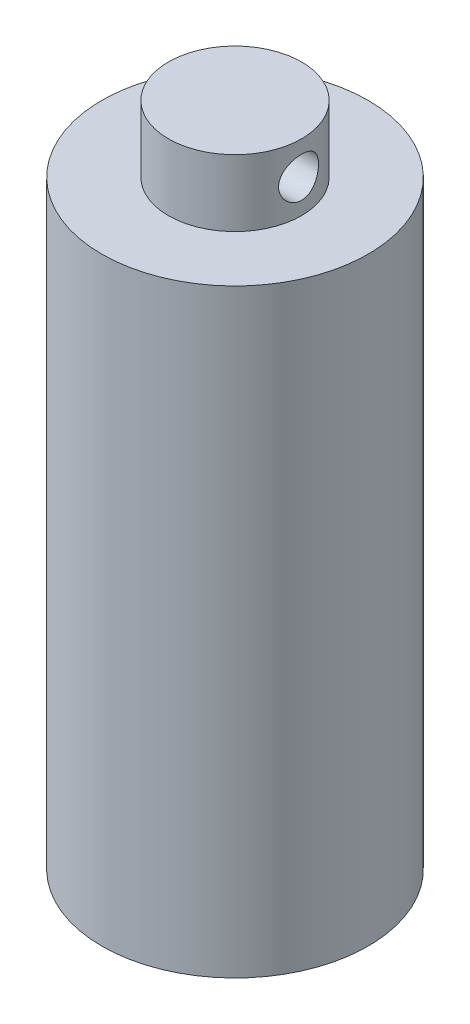
ISO-10303-21;
HEADER;
FILE_DESCRIPTION(('STEP AP214'),'2;1');
FILE_NAME('part.step','',(''),(''),'','','');
FILE_SCHEMA(('AUTOMOTIVE_DESIGN { 1 0 10303 214 1 1 1 1 }'));
ENDSEC;
DATA;
#1=APPLICATION_CONTEXT('core data for automotive mechanical design processes');
#2=APPLICATION_PROTOCOL_DEFINITION('international standard','automotive_design',2000,#1);
#3=PRODUCT_CONTEXT('',#1,'mechanical');
#4=PRODUCT('Part','Part','',(#3));
#5=PRODUCT_RELATED_PRODUCT_CATEGORY('part','',(#4));
#6=PRODUCT_DEFINITION_FORMATION('','',#4);
#7=PRODUCT_DEFINITION_CONTEXT('part definition',#1,'design');
#8=PRODUCT_DEFINITION('design','',#6,#7);
#9=PRODUCT_DEFINITION_SHAPE('','',#8);
#10=(LENGTH_UNIT() NAMED_UNIT(*) SI_UNIT(.MILLI.,.METRE.));
#11=(NAMED_UNIT(*) PLANE_ANGLE_UNIT() SI_UNIT($,.RADIAN.));
#12=(NAMED_UNIT(*) SI_UNIT($,.STERADIAN.) SOLID_ANGLE_UNIT());
#13=UNCERTAINTY_MEASURE_WITH_UNIT(LENGTH_MEASURE(1.E-05),#10,'distance_accuracy_value','');
#14=(GEOMETRIC_REPRESENTATION_CONTEXT(3) GLOBAL_UNCERTAINTY_ASSIGNED_CONTEXT((#13)) GLOBAL_UNIT_ASSIGNED_CONTEXT((#10,
#11,#12)) REPRESENTATION_CONTEXT('',''));
#15=CARTESIAN_POINT('',(0.,0.,0.));
#16=DIRECTION('',(0.,0.,1.));
#17=DIRECTION('',(1.,0.,0.));
#18=AXIS2_PLACEMENT_3D('',#15,#16,#17);
#19=CARTESIAN_POINT('',(7.40987557722377E-10,14.2166164454677,-3.61810756681271E-08));
#20=DIRECTION('',(0.,-1.,0.));
#21=DIRECTION('',(0.,0.,-1.));
#22=AXIS2_PLACEMENT_3D('',#19,#20,#21);
#23=CYLINDRICAL_SURFACE('',#22,3.81);
#24=CARTESIAN_POINT('',(7.40987557722377E-10,14.2166164454677,-3.61810756681271E-08));
#25=DIRECTION('',(0.,1.,0.));
#26=DIRECTION('',(0.,0.,1.));
#27=AXIS2_PLACEMENT_3D('',#24,#25,#26);
#28=CIRCLE('',#27,3.81);
#29=CARTESIAN_POINT('',(7.40987557722377E-10,14.2166164454677,3.80999996381892));
#30=VERTEX_POINT('',#29);
#31=EDGE_CURVE('E10',#30,#30,#28,.T.);
#32=ORIENTED_EDGE('',*,*,#31,.F.);
#33=EDGE_LOOP('',(#32));
#34=FACE_BOUND('',#33,.T.);
#35=CARTESIAN_POINT('',(7.40987557722377E-10,-2.92838355453233,-3.61810756681271E-08));
#36=DIRECTION('',(0.,1.,0.));
#37=DIRECTION('',(0.,0.,1.));
#38=AXIS2_PLACEMENT_3D('',#35,#36,#37);
#39=CIRCLE('',#38,3.81);
#40=CARTESIAN_POINT('',(7.40987557722377E-10,-2.92838355453233,3.80999996381892));
#41=VERTEX_POINT('',#40);
#42=EDGE_CURVE('E49',#41,#41,#39,.T.);
#43=ORIENTED_EDGE('',*,*,#42,.T.);
#44=EDGE_LOOP('',(#43));
#45=FACE_BOUND('',#44,.T.);
#46=ADVANCED_FACE('F37',(#34,#45),#23,.T.);
#47=CARTESIAN_POINT('',(7.40987557722377E-10,14.2166164454677,-3.61810756681271E-08));
#48=DIRECTION('',(0.,1.,0.));
#49=DIRECTION('',(0.,0.,1.));
#50=AXIS2_PLACEMENT_3D('',#47,#48,#49);
#51=PLANE('',#50);
#52=CARTESIAN_POINT('',(7.40987557722377E-10,14.2166164454677,-3.61810756681271E-08));
#53=DIRECTION('',(0.,1.,0.));
#54=DIRECTION('',(0.,0.,1.));
#55=AXIS2_PLACEMENT_3D('',#52,#53,#54);
#56=CIRCLE('',#55,1.905);
#57=CARTESIAN_POINT('',(7.40987557722377E-10,14.2166164454677,1.90499996381892));
#58=VERTEX_POINT('',#57);
#59=EDGE_CURVE('E57',#58,#58,#56,.T.);
#60=ORIENTED_EDGE('',*,*,#59,.F.);
#61=EDGE_LOOP('',(#60));
#62=FACE_BOUND('',#61,.T.);
#63=ORIENTED_EDGE('',*,*,#31,.T.);
#64=EDGE_LOOP('',(#63));
#65=FACE_BOUND('',#64,.T.);
#66=ADVANCED_FACE('F83',(#62,#65),#51,.T.);
#67=CARTESIAN_POINT('',(7.40987557722377E-10,-2.92838355453233,-3.61810756681271E-08));
#68=DIRECTION('',(0.,1.,0.));
#69=DIRECTION('',(0.,0.,1.));
#70=AXIS2_PLACEMENT_3D('',#67,#68,#69);
#71=PLANE('',#70);
#72=ORIENTED_EDGE('',*,*,#42,.F.);
#73=EDGE_LOOP('',(#72));
#74=FACE_BOUND('',#73,.T.);
#75=ADVANCED_FACE('F79',(#74),#71,.F.);
#76=CARTESIAN_POINT('',(7.40987557722377E-10,16.1216164454677,-3.61810756681271E-08));
#77=DIRECTION('',(0.,-1.,0.));
#78=DIRECTION('',(0.,0.,-1.));
#79=AXIS2_PLACEMENT_3D('',#76,#77,#78);
#80=CYLINDRICAL_SURFACE('',#79,1.905);
#81=CARTESIAN_POINT('',(-1.81725417795829,15.1691164454677,-0.571500036181076));
#82=CARTESIAN_POINT('',(-1.81725450202238,15.2004325682242,-0.57149964616737));
#83=CARTESIAN_POINT('',(-1.8180725265083,15.2317525498383,-0.568917268305004));
#84=CARTESIAN_POINT('',(-1.82124316314864,15.2934768455361,-0.558682603530016));
#85=CARTESIAN_POINT('',(-1.82359628804812,15.3238808501195,-0.551028622617429));
#86=CARTESIAN_POINT('',(-1.82954714958093,15.3828706769484,-0.530934026137226));
#87=CARTESIAN_POINT('',(-1.83314281515854,15.4114594315603,-0.518501371772505));
#88=CARTESIAN_POINT('',(-1.84117081230504,15.4661524023174,-0.489228503689025));
#89=CARTESIAN_POINT('',(-1.8456032690961,15.4922562457258,-0.47238763015342));
#90=CARTESIAN_POINT('',(-1.85496274417567,15.5420645402783,-0.434205749460496));
#91=CARTESIAN_POINT('',(-1.85990029892336,15.5656787325854,-0.412749555520851));
#92=CARTESIAN_POINT('',(-1.86962362324104,15.6090335049214,-0.36619294269895));
#93=CARTESIAN_POINT('',(-1.87440937323407,15.628773587029,-0.341092056101771));
#94=CARTESIAN_POINT('',(-1.88340954680566,15.6642117341042,-0.287316493980457));
#95=CARTESIAN_POINT('',(-1.88761010900335,15.6798177701804,-0.258578648310016));
#96=CARTESIAN_POINT('',(-1.89484420011704,15.7059405911629,-0.198739026066801));
#97=CARTESIAN_POINT('',(-1.89787798069705,15.7164584736634,-0.167637760996869));
#98=CARTESIAN_POINT('',(-1.90236213053263,15.7318077258832,-0.10489842403342));
#99=CARTESIAN_POINT('',(-1.90385531283618,15.7367931591033,-0.0733011591824725));
#100=CARTESIAN_POINT('',(-1.90524079697916,15.741423146158,-0.00968575102956392));
#101=CARTESIAN_POINT('',(-1.90513343506432,15.7410688217798,0.0223323024601156));
#102=CARTESIAN_POINT('',(-1.90336018980429,15.7351327625528,0.0847995744835859));
#103=CARTESIAN_POINT('',(-1.90174405024107,15.7297178666261,0.115266281790275));
#104=CARTESIAN_POINT('',(-1.89719529850798,15.7140869064538,0.174836754140527));
#105=CARTESIAN_POINT('',(-1.8942626029687,15.7038705381585,0.203940432742929));
#106=CARTESIAN_POINT('',(-1.88734149121939,15.6788136645452,0.260355295158763));
#107=CARTESIAN_POINT('',(-1.88334117672744,15.6639206871981,0.28764165346752));
#108=CARTESIAN_POINT('',(-1.87470913012798,15.6299748636925,0.339381304530306));
#109=CARTESIAN_POINT('',(-1.87007724831828,15.6109210306286,0.363833923045205));
#110=CARTESIAN_POINT('',(-1.86046700661962,15.5683291024313,0.410207607281779));
#111=CARTESIAN_POINT('',(-1.85548217343642,15.5446464593173,0.431994748951753));
#112=CARTESIAN_POINT('',(-1.84588396262774,15.4939151286516,0.471326116185649));
#113=CARTESIAN_POINT('',(-1.841270621947,15.4668661069945,0.48886992009858));
#114=CARTESIAN_POINT('',(-1.83290681045212,15.4098172076837,0.519356286047003));
#115=CARTESIAN_POINT('',(-1.82916503804793,15.3797915209935,0.532253112814533));
#116=CARTESIAN_POINT('',(-1.82307125483124,15.3178560990503,0.55276757638563));
#117=CARTESIAN_POINT('',(-1.82071879067906,15.2859469821143,0.560386935399275));
#118=CARTESIAN_POINT('',(-1.81776947614541,15.2224250660289,0.569879838593526));
#119=CARTESIAN_POINT('',(-1.8171104574853,15.1908455521678,0.571956959527624));
#120=CARTESIAN_POINT('',(-1.81745074295234,15.1277882705654,0.570874922776948));
#121=CARTESIAN_POINT('',(-1.81844981494537,15.0963104891997,0.567716498073168));
#122=CARTESIAN_POINT('',(-1.82193269722707,15.0351993734582,0.556434323036357));
#123=CARTESIAN_POINT('',(-1.82437726171871,15.0055393668826,0.54844169687204));
#124=CARTESIAN_POINT('',(-1.83043502738383,14.9479834012679,0.527870045038638));
#125=CARTESIAN_POINT('',(-1.83404840898626,14.9200877153803,0.515290311224855));
#126=CARTESIAN_POINT('',(-1.8421572306874,14.866024291656,0.485515393077572));
#127=CARTESIAN_POINT('',(-1.84667374203242,14.839923026772,0.468205393317015));
#128=CARTESIAN_POINT('',(-1.85603466277656,14.7909213270128,0.429597662916393));
#129=CARTESIAN_POINT('',(-1.86087915048101,14.7680216605572,0.408298977806881));
#130=CARTESIAN_POINT('',(-1.87057144307678,14.7251827108522,0.361361369298985));
#131=CARTESIAN_POINT('',(-1.87541247294887,14.7053877708236,0.335588979910607));
#132=CARTESIAN_POINT('',(-1.88436828442156,14.6704001323761,0.28097290374781));
#133=CARTESIAN_POINT('',(-1.88848310208484,14.6552072054009,0.252129369596167));
#134=CARTESIAN_POINT('',(-1.89549774676855,14.6300014338211,0.192380391111613));
#135=CARTESIAN_POINT('',(-1.89840661680812,14.6199498973111,0.16149238481534));
#136=CARTESIAN_POINT('',(-1.90272154152294,14.6052132353704,0.0983627210571717));
#137=CARTESIAN_POINT('',(-1.90412802616507,14.6005265745413,0.0661214536310882));
#138=CARTESIAN_POINT('',(-1.90525353220914,14.5967694656829,0.00253443444824873));
#139=CARTESIAN_POINT('',(-1.90503545173315,14.5974896885173,-0.028797989412921));
#140=CARTESIAN_POINT('',(-1.9030845768708,14.6040254874498,-0.0908759585047139));
#141=CARTESIAN_POINT('',(-1.90135186836807,14.6098407746437,-0.121621536910103));
#142=CARTESIAN_POINT('',(-1.89658435070424,14.6262720884609,-0.181331580949834));
#143=CARTESIAN_POINT('',(-1.89356372381133,14.6368358922949,-0.210311627501957));
#144=CARTESIAN_POINT('',(-1.8865327122393,14.6624176548949,-0.266103099764608));
#145=CARTESIAN_POINT('',(-1.88252216492825,14.6774363456267,-0.292914168176346));
#146=CARTESIAN_POINT('',(-1.87377310906462,14.7120587327485,-0.344539057193311));
#147=CARTESIAN_POINT('',(-1.86901541383798,14.731793760298,-0.369261521460326));
#148=CARTESIAN_POINT('',(-1.85936967603779,14.7750521034225,-0.415113850863879));
#149=CARTESIAN_POINT('',(-1.85448159626074,14.7985765101069,-0.436242677639405));
#150=CARTESIAN_POINT('',(-1.84495699246515,14.8495872820039,-0.474940422574316));
#151=CARTESIAN_POINT('',(-1.84033230802425,14.8771708343093,-0.492384470858925));
#152=CARTESIAN_POINT('',(-1.83204820526446,14.9350129668231,-0.522367470725676));
#153=CARTESIAN_POINT('',(-1.82838832340199,14.9652702530601,-0.534908779254214));
#154=CARTESIAN_POINT('',(-1.82280998096323,15.0242375499093,-0.553600437231731));
#155=CARTESIAN_POINT('',(-1.82074624923751,15.0527623399471,-0.560294289014284));
#156=CARTESIAN_POINT('',(-1.81796833151811,15.1105625452398,-0.569243825942559));
#157=CARTESIAN_POINT('',(-1.81725387497843,15.1398378088222,-0.571500400819753));
#158=CARTESIAN_POINT('',(-1.81725417795829,15.1691164454677,-0.571500036181076));
#159=B_SPLINE_CURVE_WITH_KNOTS('',3,(#81,#82,#83,#84,#85,#86,#87,#88,#89,#90,#91,#92,#93,#94,
#95,#96,#97,#98,#99,#100,#101,#102,#103,#104,#105,#106,#107,#108,#109,#110,#111,#112,#113,#114,
#115,#116,#117,#118,#119,#120,#121,#122,#123,#124,#125,#126,#127,#128,#129,#130,#131,#132,#133,
#134,#135,#136,#137,#138,#139,#140,#141,#142,#143,#144,#145,#146,#147,#148,#149,#150,#151,#152,
#153,#154,#155,#156,#157,#158),.UNSPECIFIED.,.T.,.F.,(4,2,2,2,2,2,2,2,2,2,2,2,2,2,2,2,2,2,2,2,2,
2,2,2,2,2,2,2,2,2,2,2,2,2,2,2,2,2,4),(0.,0.0938403632002313,0.187712086457203,0.28142809388531,
0.3751581366397,0.471575701504111,0.568005650363246,0.666429728606281,0.764832565763506,
0.860420453943509,0.955988261100182,1.04851247999895,1.14104255871603,1.23465034754262,
1.32828036318476,1.42551968013238,1.52276865556769,1.62095016769197,1.71909962486794,
1.81359078777209,1.90806872294755,2.0000922466653,2.09212998273286,2.18663798814218,
2.2811686377376,2.3792669181917,2.47736032585362,2.57470424276099,2.67202029339402,
2.76558871785016,2.85915183706035,2.95171023903156,3.04428385736056,3.13981957902601,
3.23538285846829,3.33379434708786,3.43215846695104,3.51991099614528,3.60764592802627),.UNSPECIFIED.);
#160=CARTESIAN_POINT('',(-1.81725417795829,15.1691164454677,-0.571500036181076));
#161=VERTEX_POINT('',#160);
#162=EDGE_CURVE('E40',#161,#161,#159,.T.);
#163=ORIENTED_EDGE('',*,*,#162,.T.);
#164=EDGE_LOOP('',(#163));
#165=FACE_BOUND('',#164,.T.);
#166=CARTESIAN_POINT('',(1.81725417944027,15.1691164454677,-0.571500036181076));
#167=CARTESIAN_POINT('',(1.81725450350436,15.1378003227111,-0.57149964616737));
#168=CARTESIAN_POINT('',(1.81807252799028,15.106480341097,-0.568917268305004));
#169=CARTESIAN_POINT('',(1.82124316463062,15.0447560453992,-0.558682603530017));
#170=CARTESIAN_POINT('',(1.8235962895301,15.0143520408158,-0.551028622617429));
#171=CARTESIAN_POINT('',(1.8295471510629,14.955362213987,-0.530934026137226));
#172=CARTESIAN_POINT('',(1.83314281664051,14.926773459375,-0.518501371772505));
#173=CARTESIAN_POINT('',(1.84117081378701,14.8720804886179,-0.489228503689024));
#174=CARTESIAN_POINT('',(1.84560327057808,14.8459766452096,-0.47238763015342));
#175=CARTESIAN_POINT('',(1.85496274565764,14.796168350657,-0.434205749460496));
#176=CARTESIAN_POINT('',(1.85990030040534,14.7725541583499,-0.412749555520851));
#177=CARTESIAN_POINT('',(1.86962362472301,14.729199386014,-0.36619294269895));
#178=CARTESIAN_POINT('',(1.87440937471605,14.7094593039063,-0.341092056101771));
#179=CARTESIAN_POINT('',(1.88340954828764,14.6740211568311,-0.287316493980457));
#180=CARTESIAN_POINT('',(1.88761011048533,14.6584151207549,-0.258578648310016));
#181=CARTESIAN_POINT('',(1.89484420159902,14.6322922997724,-0.198739026066801));
#182=CARTESIAN_POINT('',(1.89787798217902,14.621774417272,-0.167637760996869));
#183=CARTESIAN_POINT('',(1.90236213201461,14.6064251650522,-0.10489842403342));
#184=CARTESIAN_POINT('',(1.90385531431815,14.601439731832,-0.0733011591824725));
#185=CARTESIAN_POINT('',(1.90524079846114,14.5968097447774,-0.00968575102956392));
#186=CARTESIAN_POINT('',(1.9051334365463,14.5971640691555,0.0223323024601155));
#187=CARTESIAN_POINT('',(1.90336019128627,14.6031001283826,0.0847995744835862));
#188=CARTESIAN_POINT('',(1.90174405172304,14.6085150243092,0.115266281790276));
#189=CARTESIAN_POINT('',(1.89719529998995,14.6241459844815,0.174836754140528));
#190=CARTESIAN_POINT('',(1.89426260445067,14.6343623527768,0.203940432742929));
#191=CARTESIAN_POINT('',(1.88734149270136,14.6594192263901,0.260355295158763));
#192=CARTESIAN_POINT('',(1.88334117820942,14.6743122037372,0.287641653467521));
#193=CARTESIAN_POINT('',(1.87470913160995,14.7082580272428,0.339381304530306));
#194=CARTESIAN_POINT('',(1.87007724980025,14.7273118603067,0.363833923045205));
#195=CARTESIAN_POINT('',(1.86046700810159,14.769903788504,0.410207607281779));
#196=CARTESIAN_POINT('',(1.85548217491839,14.793586431618,0.431994748951753));
#197=CARTESIAN_POINT('',(1.84588396410971,14.8443177622838,0.471326116185649));
#198=CARTESIAN_POINT('',(1.84127062342897,14.8713667839409,0.48886992009858));
#199=CARTESIAN_POINT('',(1.83290681193409,14.9284156832516,0.519356286047003));
#200=CARTESIAN_POINT('',(1.8291650395299,14.9584413699418,0.532253112814533));
#201=CARTESIAN_POINT('',(1.82307125631322,15.0203767918851,0.55276757638563));
#202=CARTESIAN_POINT('',(1.82071879216103,15.052285908821,0.560386935399275));
#203=CARTESIAN_POINT('',(1.81776947762739,15.1158078249064,0.569879838593526));
#204=CARTESIAN_POINT('',(1.81711045896727,15.1473873387675,0.571956959527624));
#205=CARTESIAN_POINT('',(1.81745074443432,15.2104446203699,0.570874922776948));
#206=CARTESIAN_POINT('',(1.81844981642735,15.2419224017356,0.567716498073168));
#207=CARTESIAN_POINT('',(1.82193269870905,15.3030335174771,0.556434323036357));
#208=CARTESIAN_POINT('',(1.82437726320068,15.3326935240528,0.548441696872039));
#209=CARTESIAN_POINT('',(1.83043502886581,15.3902494896675,0.527870045038637));
#210=CARTESIAN_POINT('',(1.83404841046824,15.418145175555,0.515290311224854));
#211=CARTESIAN_POINT('',(1.84215723216937,15.4722085992793,0.485515393077573));
#212=CARTESIAN_POINT('',(1.84667374351439,15.4983098641633,0.468205393317017));
#213=CARTESIAN_POINT('',(1.85603466425854,15.5473115639225,0.429597662916395));
#214=CARTESIAN_POINT('',(1.86087915196299,15.5702112303781,0.408298977806882));
#215=CARTESIAN_POINT('',(1.87057144455875,15.6130501800831,0.361361369298985));
#216=CARTESIAN_POINT('',(1.87541247443084,15.6328451201117,0.335588979910607));
#217=CARTESIAN_POINT('',(1.88436828590354,15.6678327585592,0.28097290374781));
#218=CARTESIAN_POINT('',(1.88848310356681,15.6830256855344,0.252129369596167));
#219=CARTESIAN_POINT('',(1.89549774825052,15.7082314571142,0.192380391111613));
#220=CARTESIAN_POINT('',(1.89840661829009,15.7182829936242,0.16149238481534));
#221=CARTESIAN_POINT('',(1.90272154300491,15.7330196555649,0.0983627210571719));
#222=CARTESIAN_POINT('',(1.90412802764704,15.737706316394,0.0661214536310883));
#223=CARTESIAN_POINT('',(1.90525353369112,15.7414634252524,0.00253443444824881));
#224=CARTESIAN_POINT('',(1.90503545321512,15.7407432024181,-0.0287979894129208));
#225=CARTESIAN_POINT('',(1.90308457835278,15.7342074034855,-0.0908759585047137));
#226=CARTESIAN_POINT('',(1.90135186985005,15.7283921162916,-0.121621536910103));
#227=CARTESIAN_POINT('',(1.89658435218622,15.7119608024744,-0.181331580949834));
#228=CARTESIAN_POINT('',(1.8935637252933,15.7013969986404,-0.210311627501957));
#229=CARTESIAN_POINT('',(1.88653271372128,15.6758152360404,-0.266103099764608));
#230=CARTESIAN_POINT('',(1.88252216641023,15.6607965453086,-0.292914168176346));
#231=CARTESIAN_POINT('',(1.87377311054659,15.6261741581868,-0.344539057193311));
#232=CARTESIAN_POINT('',(1.86901541531996,15.6064391306374,-0.369261521460326));
#233=CARTESIAN_POINT('',(1.85936967751977,15.5631807875129,-0.415113850863878));
#234=CARTESIAN_POINT('',(1.85448159774271,15.5396563808284,-0.436242677639404));
#235=CARTESIAN_POINT('',(1.84495699394712,15.4886456089314,-0.474940422574316));
#236=CARTESIAN_POINT('',(1.84033230950622,15.461062056626,-0.492384470858926));
#237=CARTESIAN_POINT('',(1.83204820674643,15.4032199241122,-0.522367470725676));
#238=CARTESIAN_POINT('',(1.82838832488397,15.3729626378752,-0.534908779254214));
#239=CARTESIAN_POINT('',(1.82280998244521,15.313995341026,-0.553600437231731));
#240=CARTESIAN_POINT('',(1.82074625071948,15.2854705509882,-0.560294289014284));
#241=CARTESIAN_POINT('',(1.81796833300008,15.2276703456955,-0.569243825942559));
#242=CARTESIAN_POINT('',(1.8172538764604,15.1983950821132,-0.571500400819753));
#243=CARTESIAN_POINT('',(1.81725417944027,15.1691164454677,-0.571500036181076));
#244=B_SPLINE_CURVE_WITH_KNOTS('',3,(#166,#167,#168,#169,#170,#171,#172,#173,#174,#175,#176,
#177,#178,#179,#180,#181,#182,#183,#184,#185,#186,#187,#188,#189,#190,#191,#192,#193,#194,#195,
#196,#197,#198,#199,#200,#201,#202,#203,#204,#205,#206,#207,#208,#209,#210,#211,#212,#213,#214,
#215,#216,#217,#218,#219,#220,#221,#222,#223,#224,#225,#226,#227,#228,#229,#230,#231,#232,#233,
#234,#235,#236,#237,#238,#239,#240,#241,#242,#243),.UNSPECIFIED.,.T.,.F.,(4,2,2,2,2,2,2,2,2,2,2,
2,2,2,2,2,2,2,2,2,2,2,2,2,2,2,2,2,2,2,2,2,2,2,2,2,2,2,4),(0.,0.0938403632002295,
0.187712086457203,0.281428093885312,0.3751581366397,0.471575701504111,0.568005650363246,
0.666429728606281,0.764832565763506,0.860420453943509,0.955988261100182,1.04851247999895,
1.14104255871603,1.23465034754262,1.32828036318476,1.42551968013238,1.52276865556769,
1.62095016769197,1.71909962486794,1.81359078777209,1.90806872294755,2.0000922466653,
2.09212998273286,2.18663798814218,2.2811686377376,2.3792669181917,2.47736032585362,
2.57470424276099,2.67202029339402,2.76558871785016,2.85915183706035,2.95171023903156,
3.04428385736056,3.13981957902601,3.23538285846829,3.33379434708786,3.43215846695104,
3.51991099614529,3.60764592802627),.UNSPECIFIED.);
#245=CARTESIAN_POINT('',(1.81725417944027,15.1691164454677,-0.571500036181076));
#246=VERTEX_POINT('',#245);
#247=EDGE_CURVE('E59',#246,#246,#244,.T.);
#248=ORIENTED_EDGE('',*,*,#247,.T.);
#249=EDGE_LOOP('',(#248));
#250=FACE_BOUND('',#249,.T.);
#251=CARTESIAN_POINT('',(7.40987557722377E-10,16.1216164454677,-3.61810756681271E-08));
#252=DIRECTION('',(0.,1.,0.));
#253=DIRECTION('',(0.,0.,1.));
#254=AXIS2_PLACEMENT_3D('',#251,#252,#253);
#255=CIRCLE('',#254,1.905);
#256=CARTESIAN_POINT('',(7.40987557722377E-10,16.1216164454677,1.90499996381892));
#257=VERTEX_POINT('',#256);
#258=EDGE_CURVE('E54',#257,#257,#255,.T.);
#259=ORIENTED_EDGE('',*,*,#258,.F.);
#260=EDGE_LOOP('',(#259));
#261=FACE_BOUND('',#260,.T.);
#262=ORIENTED_EDGE('',*,*,#59,.T.);
#263=EDGE_LOOP('',(#262));
#264=FACE_BOUND('',#263,.T.);
#265=ADVANCED_FACE('F64',(#165,#250,#261,#264),#80,.T.);
#266=CARTESIAN_POINT('',(7.40987557722377E-10,16.1216164454677,-3.61810756681271E-08));
#267=DIRECTION('',(0.,1.,0.));
#268=DIRECTION('',(0.,0.,1.));
#269=AXIS2_PLACEMENT_3D('',#266,#267,#268);
#270=PLANE('',#269);
#271=ORIENTED_EDGE('',*,*,#258,.T.);
#272=EDGE_LOOP('',(#271));
#273=FACE_BOUND('',#272,.T.);
#274=ADVANCED_FACE('F71',(#273),#270,.T.);
#275=CARTESIAN_POINT('',(-3.80999999925901,15.1691164454677,-3.61810755514795E-08));
#276=DIRECTION('',(1.,0.,0.));
#277=DIRECTION('',(0.,0.,-1.));
#278=AXIS2_PLACEMENT_3D('',#275,#276,#277);
#279=CYLINDRICAL_SURFACE('',#278,0.5715);
#280=ORIENTED_EDGE('',*,*,#247,.F.);
#281=EDGE_LOOP('',(#280));
#282=FACE_BOUND('',#281,.T.);
#283=ORIENTED_EDGE('',*,*,#162,.F.);
#284=EDGE_LOOP('',(#283));
#285=FACE_BOUND('',#284,.T.);
#286=ADVANCED_FACE('F68',(#282,#285),#279,.F.);
#287=CLOSED_SHELL('',(#46,#66,#75,#265,#274,#286));
#288=MANIFOLD_SOLID_BREP('B2',#287);
#289=ADVANCED_BREP_SHAPE_REPRESENTATION('',(#18,#288),#14);
#290=SHAPE_DEFINITION_REPRESENTATION(#9,#289);
ENDSEC;
END-ISO-10303-21;
